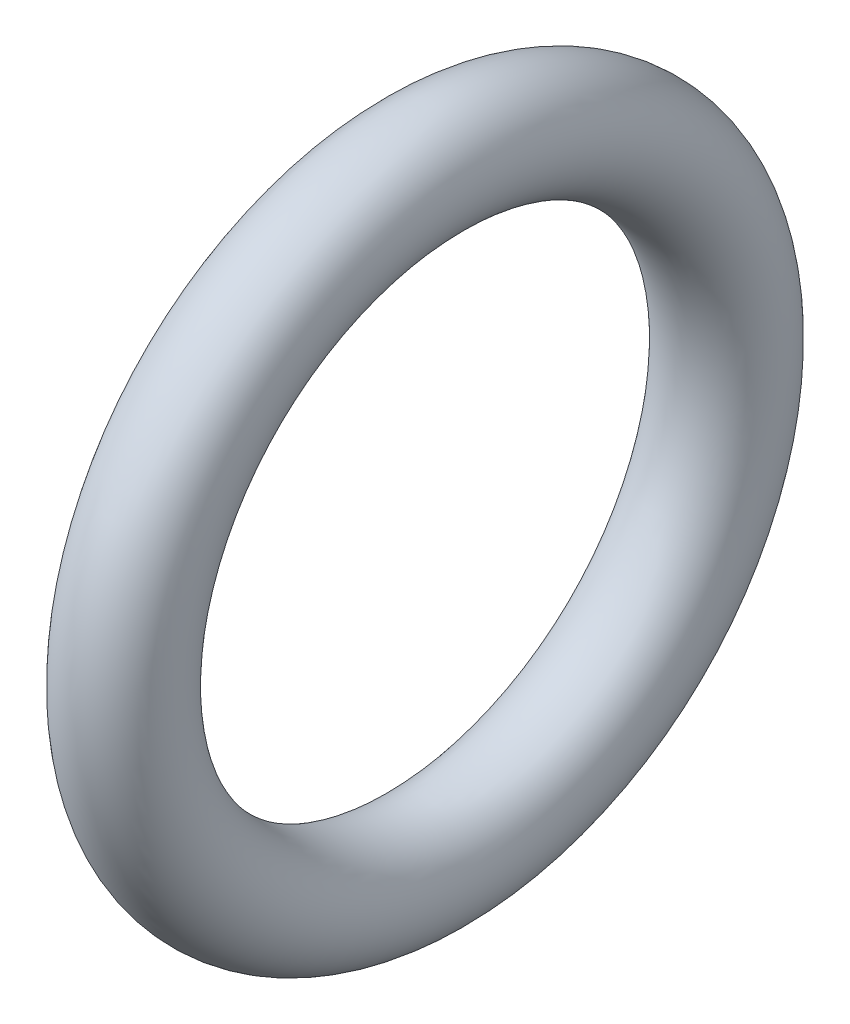
ISO-10303-21;
HEADER;
FILE_DESCRIPTION(('STEP AP214'),'2;1');
FILE_NAME('part.step','',(''),(''),'','','');
FILE_SCHEMA(('AUTOMOTIVE_DESIGN { 1 0 10303 214 1 1 1 1 }'));
ENDSEC;
DATA;
#1=APPLICATION_CONTEXT('core data for automotive mechanical design processes');
#2=APPLICATION_PROTOCOL_DEFINITION('international standard','automotive_design',2000,#1);
#3=PRODUCT_CONTEXT('',#1,'mechanical');
#4=PRODUCT('Part','Part','',(#3));
#5=PRODUCT_RELATED_PRODUCT_CATEGORY('part','',(#4));
#6=PRODUCT_DEFINITION_FORMATION('','',#4);
#7=PRODUCT_DEFINITION_CONTEXT('part definition',#1,'design');
#8=PRODUCT_DEFINITION('design','',#6,#7);
#9=PRODUCT_DEFINITION_SHAPE('','',#8);
#10=(LENGTH_UNIT() NAMED_UNIT(*) SI_UNIT(.MILLI.,.METRE.));
#11=(NAMED_UNIT(*) PLANE_ANGLE_UNIT() SI_UNIT($,.RADIAN.));
#12=(NAMED_UNIT(*) SI_UNIT($,.STERADIAN.) SOLID_ANGLE_UNIT());
#13=UNCERTAINTY_MEASURE_WITH_UNIT(LENGTH_MEASURE(1.E-05),#10,'distance_accuracy_value','');
#14=(GEOMETRIC_REPRESENTATION_CONTEXT(3) GLOBAL_UNCERTAINTY_ASSIGNED_CONTEXT((#13)) GLOBAL_UNIT_ASSIGNED_CONTEXT((#10,
#11,#12)) REPRESENTATION_CONTEXT('',''));
#15=CARTESIAN_POINT('',(0.,0.,0.));
#16=DIRECTION('',(0.,0.,1.));
#17=DIRECTION('',(1.,0.,0.));
#18=AXIS2_PLACEMENT_3D('',#15,#16,#17);
#19=CARTESIAN_POINT('',(2.5,0.,0.));
#20=DIRECTION('',(1.,0.,0.));
#21=DIRECTION('',(0.,-1.,0.));
#22=AXIS2_PLACEMENT_3D('',#19,#20,#21);
#23=TOROIDAL_SURFACE('',#22,8.3,1.5);
#24=CARTESIAN_POINT('',(2.5,-9.8,0.));
#25=VERTEX_POINT('',#24);
#26=VERTEX_LOOP('',#25);
#27=FACE_BOUND('',#26,.T.);
#28=ADVANCED_FACE('F12',(#27),#23,.T.);
#29=CLOSED_SHELL('',(#28));
#30=MANIFOLD_SOLID_BREP('B1',#29);
#31=ADVANCED_BREP_SHAPE_REPRESENTATION('',(#18,#30),#14);
#32=SHAPE_DEFINITION_REPRESENTATION(#9,#31);
ENDSEC;
END-ISO-10303-21;
